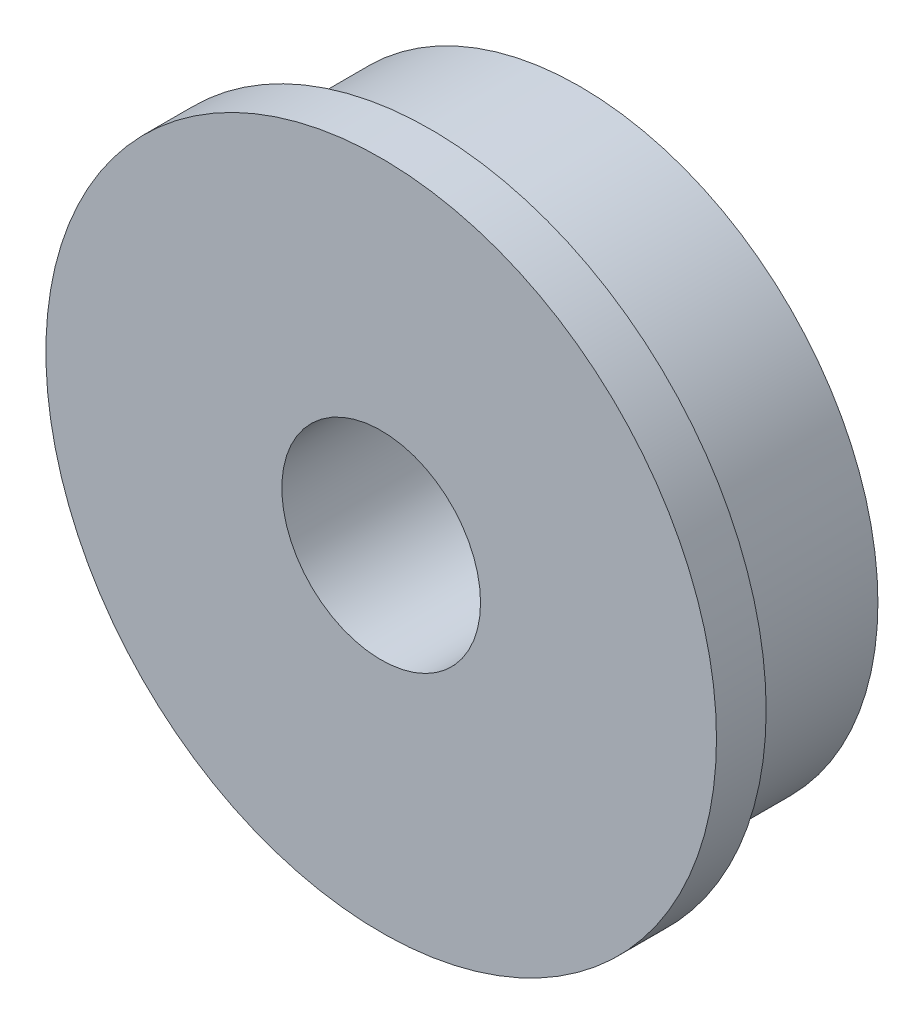
ISO-10303-21;
HEADER;
FILE_DESCRIPTION(('STEP AP214'),'2;1');
FILE_NAME('part.step','',(''),(''),'','','');
FILE_SCHEMA(('AUTOMOTIVE_DESIGN { 1 0 10303 214 1 1 1 1 }'));
ENDSEC;
DATA;
#1=APPLICATION_CONTEXT('core data for automotive mechanical design processes');
#2=APPLICATION_PROTOCOL_DEFINITION('international standard','automotive_design',2000,#1);
#3=PRODUCT_CONTEXT('',#1,'mechanical');
#4=PRODUCT('Part','Part','',(#3));
#5=PRODUCT_RELATED_PRODUCT_CATEGORY('part','',(#4));
#6=PRODUCT_DEFINITION_FORMATION('','',#4);
#7=PRODUCT_DEFINITION_CONTEXT('part definition',#1,'design');
#8=PRODUCT_DEFINITION('design','',#6,#7);
#9=PRODUCT_DEFINITION_SHAPE('','',#8);
#10=(LENGTH_UNIT() NAMED_UNIT(*) SI_UNIT(.MILLI.,.METRE.));
#11=(NAMED_UNIT(*) PLANE_ANGLE_UNIT() SI_UNIT($,.RADIAN.));
#12=(NAMED_UNIT(*) SI_UNIT($,.STERADIAN.) SOLID_ANGLE_UNIT());
#13=UNCERTAINTY_MEASURE_WITH_UNIT(LENGTH_MEASURE(1.E-05),#10,'distance_accuracy_value','');
#14=(GEOMETRIC_REPRESENTATION_CONTEXT(3) GLOBAL_UNCERTAINTY_ASSIGNED_CONTEXT((#13)) GLOBAL_UNIT_ASSIGNED_CONTEXT((#10,
#11,#12)) REPRESENTATION_CONTEXT('',''));
#15=CARTESIAN_POINT('',(0.,0.,0.));
#16=DIRECTION('',(0.,0.,1.));
#17=DIRECTION('',(1.,0.,0.));
#18=AXIS2_PLACEMENT_3D('',#15,#16,#17);
#19=CARTESIAN_POINT('',(0.,0.,0.));
#20=DIRECTION('',(0.,0.,1.));
#21=DIRECTION('',(1.,0.,0.));
#22=AXIS2_PLACEMENT_3D('',#19,#20,#21);
#23=PLANE('',#22);
#24=CARTESIAN_POINT('',(0.,0.,0.));
#25=DIRECTION('',(0.,0.,1.));
#26=DIRECTION('',(1.,0.,0.));
#27=AXIS2_PLACEMENT_3D('',#24,#25,#26);
#28=CIRCLE('',#27,6.);
#29=CARTESIAN_POINT('',(6.,0.,0.));
#30=VERTEX_POINT('',#29);
#31=EDGE_CURVE('E55',#30,#30,#28,.T.);
#32=ORIENTED_EDGE('',*,*,#31,.F.);
#33=EDGE_LOOP('',(#32));
#34=FACE_BOUND('',#33,.T.);
#35=CARTESIAN_POINT('',(0.,0.,0.));
#36=DIRECTION('',(0.,0.,1.));
#37=DIRECTION('',(1.,0.,0.));
#38=AXIS2_PLACEMENT_3D('',#35,#36,#37);
#39=CIRCLE('',#38,2.);
#40=CARTESIAN_POINT('',(2.,0.,0.));
#41=VERTEX_POINT('',#40);
#42=EDGE_CURVE('E60',#41,#41,#39,.T.);
#43=ORIENTED_EDGE('',*,*,#42,.T.);
#44=EDGE_LOOP('',(#43));
#45=FACE_BOUND('',#44,.T.);
#46=ADVANCED_FACE('F37',(#34,#45),#23,.F.);
#47=CARTESIAN_POINT('',(0.,0.,3.));
#48=DIRECTION('',(0.,0.,-1.));
#49=DIRECTION('',(-1.,0.,0.));
#50=AXIS2_PLACEMENT_3D('',#47,#48,#49);
#51=CYLINDRICAL_SURFACE('',#50,6.);
#52=CARTESIAN_POINT('',(6.,0.,2.9));
#53=CARTESIAN_POINT('',(6.,0.785398159773384,2.9));
#54=CARTESIAN_POINT('',(5.84383605862294,1.57048730950408,2.9));
#55=CARTESIAN_POINT('',(5.2427183315125,3.021713878877,2.9));
#56=CARTESIAN_POINT('',(4.79800105182659,3.68728032241198,2.9));
#57=CARTESIAN_POINT('',(3.68728032241198,4.79800105182659,2.9));
#58=CARTESIAN_POINT('',(3.02171387887724,5.2427183315124,2.9));
#59=CARTESIAN_POINT('',(1.57048730950384,5.84383605862304,2.9));
#60=CARTESIAN_POINT('',(0.785398159773436,6.,2.9));
#61=CARTESIAN_POINT('',(-0.785398159773435,6.,2.9));
#62=CARTESIAN_POINT('',(-1.57048730950399,5.84383605862298,2.9));
#63=CARTESIAN_POINT('',(-3.02171387887709,5.24271833151246,2.9));
#64=CARTESIAN_POINT('',(-3.68728032241205,4.79800105182653,2.9));
#65=CARTESIAN_POINT('',(-4.79800105182653,3.68728032241204,2.9));
#66=CARTESIAN_POINT('',(-5.24271833151244,3.02171387887713,2.9));
#67=CARTESIAN_POINT('',(-5.84383605862299,1.57048730950397,2.9));
#68=CARTESIAN_POINT('',(-6.,0.785398159773436,2.9));
#69=CARTESIAN_POINT('',(-6.,-0.785398159773435,2.9));
#70=CARTESIAN_POINT('',(-5.84383605862299,-1.57048730950395,2.9));
#71=CARTESIAN_POINT('',(-5.24271833151245,-3.02171387887711,2.9));
#72=CARTESIAN_POINT('',(-4.79800105182653,-3.68728032241204,2.9));
#73=CARTESIAN_POINT('',(-3.68728032241204,-4.79800105182653,2.9));
#74=CARTESIAN_POINT('',(-3.02171387887736,-5.24271833151234,2.9));
#75=CARTESIAN_POINT('',(-1.57048730950373,-5.84383605862309,2.9));
#76=CARTESIAN_POINT('',(-0.785398159773427,-6.,2.9));
#77=CARTESIAN_POINT('',(0.785398159773446,-6.,2.9));
#78=CARTESIAN_POINT('',(1.57048730950373,-5.84383605862308,2.9));
#79=CARTESIAN_POINT('',(3.02171387887732,-5.24271833151237,2.9));
#80=CARTESIAN_POINT('',(3.68728032241208,-4.79800105182649,2.9));
#81=CARTESIAN_POINT('',(4.79800105182646,-3.68728032241211,2.9));
#82=CARTESIAN_POINT('',(5.24271833151241,-3.02171387887722,2.9));
#83=CARTESIAN_POINT('',(5.84383605862303,-1.57048730950387,2.9));
#84=CARTESIAN_POINT('',(6.,-0.785398159773385,2.9));
#85=CARTESIAN_POINT('',(6.,0.,2.9));
#86=(BOUNDED_CURVE() B_SPLINE_CURVE(3,(#52,#53,#54,#55,#56,#57,#58,#59,#60,#61,#62,#63,#64,#65,
#66,#67,#68,#69,#70,#71,#72,#73,#74,#75,#76,#77,#78,#79,#80,#81,#82,#83,#84,#85),.UNSPECIFIED.,
.T.,.F.) B_SPLINE_CURVE_WITH_KNOTS((4,2,2,2,2,2,2,2,2,2,2,2,2,2,2,2,4),(0.,0.392699081698724,
0.785398163397448,1.17809724509617,1.5707963267949,1.96349540849362,2.35619449019234,
2.74889357189107,3.14159265358979,3.53429173528852,3.92699081698724,4.31968989868597,
4.71238898038469,5.10508806208341,5.49778714378214,5.89048622548086,6.28318530717959),
.UNSPECIFIED.) CURVE() GEOMETRIC_REPRESENTATION_ITEM() RATIONAL_B_SPLINE_CURVE((0.999999999999994,
0.999999999999994,0.999999999999994,0.999999999999994,0.999999999999994,0.999999999999994,
0.999999999999994,0.999999999999994,0.999999999999994,0.999999999999994,0.999999999999994,
0.999999999999994,0.999999999999994,0.999999999999994,0.999999999999994,0.999999999999994,
0.999999999999994,0.999999999999994,0.999999999999994,0.999999999999994,0.999999999999994,
0.999999999999994,0.999999999999994,0.999999999999994,0.999999999999994,0.999999999999994,
0.999999999999994,0.999999999999994,0.999999999999994,0.999999999999994,0.999999999999994,
0.999999999999994,0.999999999999994,0.999999999999994)) REPRESENTATION_ITEM(''));
#87=CARTESIAN_POINT('',(6.,0.,2.9));
#88=VERTEX_POINT('',#87);
#89=EDGE_CURVE('E11',#88,#88,#86,.F.);
#90=ORIENTED_EDGE('',*,*,#89,.T.);
#91=EDGE_LOOP('',(#90));
#92=FACE_BOUND('',#91,.T.);
#93=ORIENTED_EDGE('',*,*,#31,.T.);
#94=EDGE_LOOP('',(#93));
#95=FACE_BOUND('',#94,.T.);
#96=ADVANCED_FACE('F91',(#92,#95),#51,.T.);
#97=CARTESIAN_POINT('',(0.,0.,3.));
#98=DIRECTION('',(0.,0.,-1.));
#99=DIRECTION('',(-1.,0.,0.));
#100=AXIS2_PLACEMENT_3D('',#97,#98,#99);
#101=CYLINDRICAL_SURFACE('',#100,2.);
#102=ORIENTED_EDGE('',*,*,#42,.F.);
#103=EDGE_LOOP('',(#102));
#104=FACE_BOUND('',#103,.T.);
#105=CARTESIAN_POINT('',(0.,0.,4.));
#106=DIRECTION('',(0.,0.,1.));
#107=DIRECTION('',(1.,0.,0.));
#108=AXIS2_PLACEMENT_3D('',#105,#106,#107);
#109=CIRCLE('',#108,2.);
#110=CARTESIAN_POINT('',(2.,0.,4.));
#111=VERTEX_POINT('',#110);
#112=EDGE_CURVE('E168',#111,#111,#109,.T.);
#113=ORIENTED_EDGE('',*,*,#112,.T.);
#114=EDGE_LOOP('',(#113));
#115=FACE_BOUND('',#114,.T.);
#116=ADVANCED_FACE('F88',(#104,#115),#101,.F.);
#117=CARTESIAN_POINT('',(0.,0.,4.));
#118=DIRECTION('',(0.,0.,1.));
#119=DIRECTION('',(1.,0.,0.));
#120=AXIS2_PLACEMENT_3D('',#117,#118,#119);
#121=PLANE('',#120);
#122=CARTESIAN_POINT('',(0.,0.,4.));
#123=DIRECTION('',(0.,0.,1.));
#124=DIRECTION('',(1.,0.,0.));
#125=AXIS2_PLACEMENT_3D('',#122,#123,#124);
#126=CIRCLE('',#125,6.75);
#127=CARTESIAN_POINT('',(6.75,0.,4.));
#128=VERTEX_POINT('',#127);
#129=EDGE_CURVE('E65',#128,#128,#126,.T.);
#130=ORIENTED_EDGE('',*,*,#129,.T.);
#131=EDGE_LOOP('',(#130));
#132=FACE_BOUND('',#131,.T.);
#133=ORIENTED_EDGE('',*,*,#112,.F.);
#134=EDGE_LOOP('',(#133));
#135=FACE_BOUND('',#134,.T.);
#136=ADVANCED_FACE('F84',(#132,#135),#121,.T.);
#137=CARTESIAN_POINT('',(0.,0.,3.));
#138=DIRECTION('',(0.,0.,1.));
#139=DIRECTION('',(1.,0.,0.));
#140=AXIS2_PLACEMENT_3D('',#137,#138,#139);
#141=PLANE('',#140);
#142=CARTESIAN_POINT('',(6.01,0.,3.));
#143=CARTESIAN_POINT('',(6.01,-0.786707156706341,3.));
#144=CARTESIAN_POINT('',(5.85357578538745,-1.57310478835303,3.));
#145=CARTESIAN_POINT('',(5.25145619539821,-3.02675006867536,3.));
#146=CARTESIAN_POINT('',(4.80599772024636,-3.69342578961628,3.));
#147=CARTESIAN_POINT('',(3.69342578961592,-4.80599772024604,3.));
#148=CARTESIAN_POINT('',(3.02675006867535,-5.25145619539787,3.));
#149=CARTESIAN_POINT('',(1.57310478835301,-5.8535757853878,3.));
#150=CARTESIAN_POINT('',(0.786707156706402,-6.01,3.));
#151=CARTESIAN_POINT('',(-0.786707156706383,-6.01,3.));
#152=CARTESIAN_POINT('',(-1.57310478835286,-5.85357578538745,3.));
#153=CARTESIAN_POINT('',(-3.02675006867554,-5.25145619539821,3.));
#154=CARTESIAN_POINT('',(-3.69342578961605,-4.80599772024625,3.));
#155=CARTESIAN_POINT('',(-4.80599772024625,-3.69342578961605,3.));
#156=CARTESIAN_POINT('',(-5.25145619539834,-3.02675006867529,3.));
#157=CARTESIAN_POINT('',(-5.85357578538733,-1.57310478835308,3.));
#158=CARTESIAN_POINT('',(-6.01,-0.786707156706391,3.));
#159=CARTESIAN_POINT('',(-6.01,0.786707156706392,3.));
#160=CARTESIAN_POINT('',(-5.85357578538733,1.57310478835309,3.));
#161=CARTESIAN_POINT('',(-5.25145619539833,3.0267500686753,3.));
#162=CARTESIAN_POINT('',(-4.80599772024625,3.69342578961605,3.));
#163=CARTESIAN_POINT('',(-3.69342578961605,4.80599772024625,3.));
#164=CARTESIAN_POINT('',(-3.02675006867524,5.25145619539827,3.));
#165=CARTESIAN_POINT('',(-1.57310478835314,5.85357578538739,3.));
#166=CARTESIAN_POINT('',(-0.786707156706391,6.01,3.));
#167=CARTESIAN_POINT('',(0.786707156706392,6.01,3.));
#168=CARTESIAN_POINT('',(1.57310478835297,5.85357578538739,3.));
#169=CARTESIAN_POINT('',(3.02675006867541,5.25145619539827,3.));
#170=CARTESIAN_POINT('',(3.69342578961599,4.80599772024631,3.));
#171=CARTESIAN_POINT('',(4.80599772024631,3.69342578961599,3.));
#172=CARTESIAN_POINT('',(5.25145619539837,3.02675006867517,3.));
#173=CARTESIAN_POINT('',(5.85357578538729,1.57310478835321,3.));
#174=CARTESIAN_POINT('',(6.01,0.78670715670634,3.));
#175=CARTESIAN_POINT('',(6.01,0.,3.));
#176=(BOUNDED_CURVE() B_SPLINE_CURVE(3,(#142,#143,#144,#145,#146,#147,#148,#149,#150,#151,#152,
#153,#154,#155,#156,#157,#158,#159,#160,#161,#162,#163,#164,#165,#166,#167,#168,#169,#170,#171,
#172,#173,#174,#175),.UNSPECIFIED.,.T.,.F.) B_SPLINE_CURVE_WITH_KNOTS((4,2,2,2,2,2,2,2,2,2,2,2,
2,2,2,2,4),(0.,0.392699081698725,0.785398163397448,1.17809724509617,1.5707963267949,
1.96349540849362,2.35619449019234,2.74889357189107,3.14159265358979,3.53429173528852,
3.92699081698724,4.31968989868597,4.71238898038469,5.10508806208341,5.49778714378214,
5.89048622548086,6.28318530717959),
.UNSPECIFIED.) CURVE() GEOMETRIC_REPRESENTATION_ITEM() RATIONAL_B_SPLINE_CURVE((1.,1.,1.,1.,1.,
1.,1.,1.,1.,1.,1.,1.,1.,1.,1.,1.,1.,1.,1.,1.,1.,1.,1.,1.,1.,1.,1.,1.,1.,1.,1.,1.,1.,1.)) REPRESENTATION_ITEM(''));
#177=CARTESIAN_POINT('',(6.01,0.,3.));
#178=VERTEX_POINT('',#177);
#179=EDGE_CURVE('E50',#178,#178,#176,.F.);
#180=ORIENTED_EDGE('',*,*,#179,.T.);
#181=EDGE_LOOP('',(#180));
#182=FACE_BOUND('',#181,.T.);
#183=CARTESIAN_POINT('',(0.,0.,3.));
#184=DIRECTION('',(0.,0.,1.));
#185=DIRECTION('',(1.,0.,0.));
#186=AXIS2_PLACEMENT_3D('',#183,#184,#185);
#187=CIRCLE('',#186,6.75);
#188=CARTESIAN_POINT('',(6.75,0.,3.));
#189=VERTEX_POINT('',#188);
#190=EDGE_CURVE('E170',#189,#189,#187,.T.);
#191=ORIENTED_EDGE('',*,*,#190,.F.);
#192=EDGE_LOOP('',(#191));
#193=FACE_BOUND('',#192,.T.);
#194=ADVANCED_FACE('F73',(#182,#193),#141,.F.);
#195=CARTESIAN_POINT('',(0.,0.,4.));
#196=DIRECTION('',(0.,0.,-1.));
#197=DIRECTION('',(-1.,0.,0.));
#198=AXIS2_PLACEMENT_3D('',#195,#196,#197);
#199=CYLINDRICAL_SURFACE('',#198,6.75);
#200=ORIENTED_EDGE('',*,*,#129,.F.);
#201=EDGE_LOOP('',(#200));
#202=FACE_BOUND('',#201,.T.);
#203=ORIENTED_EDGE('',*,*,#190,.T.);
#204=EDGE_LOOP('',(#203));
#205=FACE_BOUND('',#204,.T.);
#206=ADVANCED_FACE('F83',(#202,#205),#199,.T.);
#207=CARTESIAN_POINT('',(6.01,0.,3.));
#208=CARTESIAN_POINT('',(6.01,0.78670715670634,3.));
#209=CARTESIAN_POINT('',(5.85357578538729,1.57310478835321,3.));
#210=CARTESIAN_POINT('',(5.25145619539837,3.02675006867517,3.));
#211=CARTESIAN_POINT('',(4.80599772024631,3.69342578961599,3.));
#212=CARTESIAN_POINT('',(3.69342578961599,4.80599772024631,3.));
#213=CARTESIAN_POINT('',(3.02675006867541,5.25145619539827,3.));
#214=CARTESIAN_POINT('',(1.57310478835297,5.85357578538739,3.));
#215=CARTESIAN_POINT('',(0.786707156706392,6.01,3.));
#216=CARTESIAN_POINT('',(-0.786707156706391,6.01,3.));
#217=CARTESIAN_POINT('',(-1.57310478835314,5.85357578538739,3.));
#218=CARTESIAN_POINT('',(-3.02675006867524,5.25145619539827,3.));
#219=CARTESIAN_POINT('',(-3.69342578961605,4.80599772024625,3.));
#220=CARTESIAN_POINT('',(-4.80599772024625,3.69342578961605,3.));
#221=CARTESIAN_POINT('',(-5.25145619539833,3.0267500686753,3.));
#222=CARTESIAN_POINT('',(-5.85357578538733,1.57310478835309,3.));
#223=CARTESIAN_POINT('',(-6.01,0.786707156706392,3.));
#224=CARTESIAN_POINT('',(-6.01,-0.786707156706391,3.));
#225=CARTESIAN_POINT('',(-5.85357578538733,-1.57310478835308,3.));
#226=CARTESIAN_POINT('',(-5.25145619539834,-3.02675006867529,3.));
#227=CARTESIAN_POINT('',(-4.80599772024625,-3.69342578961605,3.));
#228=CARTESIAN_POINT('',(-3.69342578961605,-4.80599772024625,3.));
#229=CARTESIAN_POINT('',(-3.02675006867554,-5.25145619539821,3.));
#230=CARTESIAN_POINT('',(-1.57310478835286,-5.85357578538745,3.));
#231=CARTESIAN_POINT('',(-0.786707156706383,-6.01,3.));
#232=CARTESIAN_POINT('',(0.786707156706402,-6.01,3.));
#233=CARTESIAN_POINT('',(1.57310478835301,-5.8535757853878,3.));
#234=CARTESIAN_POINT('',(3.02675006867535,-5.25145619539787,3.));
#235=CARTESIAN_POINT('',(3.69342578961592,-4.80599772024604,3.));
#236=CARTESIAN_POINT('',(4.80599772024636,-3.69342578961628,3.));
#237=CARTESIAN_POINT('',(5.25145619539821,-3.02675006867536,3.));
#238=CARTESIAN_POINT('',(5.85357578538745,-1.57310478835303,3.));
#239=CARTESIAN_POINT('',(6.01,-0.786707156706341,3.));
#240=CARTESIAN_POINT('',(6.01,0.,3.));
#241=CARTESIAN_POINT('',(6.,0.,3.));
#242=CARTESIAN_POINT('',(6.,0.785398159773385,3.));
#243=CARTESIAN_POINT('',(5.8438360586228,1.57048730950419,3.));
#244=CARTESIAN_POINT('',(5.24271833151264,3.02171387887689,3.));
#245=CARTESIAN_POINT('',(4.79800105182659,3.68728032241198,3.));
#246=CARTESIAN_POINT('',(3.68728032241198,4.79800105182659,3.));
#247=CARTESIAN_POINT('',(3.0217138788773,5.24271833151254,3.));
#248=CARTESIAN_POINT('',(1.57048730950378,5.8438360586229,3.));
#249=CARTESIAN_POINT('',(0.785398159773436,6.,3.));
#250=CARTESIAN_POINT('',(-0.785398159773435,6.,3.));
#251=CARTESIAN_POINT('',(-1.57048730950412,5.8438360586229,3.));
#252=CARTESIAN_POINT('',(-3.02171387887696,5.24271833151254,3.));
#253=CARTESIAN_POINT('',(-3.68728032241205,4.79800105182652,3.));
#254=CARTESIAN_POINT('',(-4.79800105182653,3.68728032241204,3.));
#255=CARTESIAN_POINT('',(-5.2427183315126,3.02171387887736,3.));
#256=CARTESIAN_POINT('',(-5.84383605862284,1.57048730950373,3.));
#257=CARTESIAN_POINT('',(-6.,0.785398159773437,3.));
#258=CARTESIAN_POINT('',(-6.,-0.785398159773435,3.));
#259=CARTESIAN_POINT('',(-5.84383605862284,-1.57048730950372,3.));
#260=CARTESIAN_POINT('',(-5.2427183315126,-3.02171387887734,3.));
#261=CARTESIAN_POINT('',(-4.79800105182652,-3.68728032241204,3.));
#262=CARTESIAN_POINT('',(-3.68728032241204,-4.79800105182653,3.));
#263=CARTESIAN_POINT('',(-3.02171387887742,-5.24271833151248,3.));
#264=CARTESIAN_POINT('',(-1.57048730950367,-5.84383605862295,3.));
#265=CARTESIAN_POINT('',(-0.785398159773427,-6.,3.));
#266=CARTESIAN_POINT('',(0.785398159773446,-6.,3.));
#267=CARTESIAN_POINT('',(1.57048730950365,-5.8438360586233,3.));
#268=CARTESIAN_POINT('',(3.0217138788774,-5.24271833151214,3.));
#269=CARTESIAN_POINT('',(3.68728032241191,-4.79800105182632,3.));
#270=CARTESIAN_POINT('',(4.79800105182663,-3.68728032241228,3.));
#271=CARTESIAN_POINT('',(5.24271833151248,-3.02171387887725,3.));
#272=CARTESIAN_POINT('',(5.84383605862295,-1.57048730950384,3.));
#273=CARTESIAN_POINT('',(6.,-0.785398159773386,3.));
#274=CARTESIAN_POINT('',(6.,0.,3.));
#275=CARTESIAN_POINT('',(6.,0.,2.9));
#276=CARTESIAN_POINT('',(6.,0.785398159773384,2.9));
#277=CARTESIAN_POINT('',(5.84383605862294,1.57048730950408,2.9));
#278=CARTESIAN_POINT('',(5.2427183315125,3.021713878877,2.9));
#279=CARTESIAN_POINT('',(4.79800105182659,3.68728032241198,2.9));
#280=CARTESIAN_POINT('',(3.68728032241198,4.79800105182659,2.9));
#281=CARTESIAN_POINT('',(3.02171387887724,5.2427183315124,2.9));
#282=CARTESIAN_POINT('',(1.57048730950384,5.84383605862304,2.9));
#283=CARTESIAN_POINT('',(0.785398159773436,6.,2.9));
#284=CARTESIAN_POINT('',(-0.785398159773435,6.,2.9));
#285=CARTESIAN_POINT('',(-1.57048730950399,5.84383605862298,2.9));
#286=CARTESIAN_POINT('',(-3.0217138788771,5.24271833151246,2.9));
#287=CARTESIAN_POINT('',(-3.68728032241205,4.79800105182653,2.9));
#288=CARTESIAN_POINT('',(-4.79800105182653,3.68728032241204,2.9));
#289=CARTESIAN_POINT('',(-5.24271833151244,3.02171387887713,2.9));
#290=CARTESIAN_POINT('',(-5.84383605862299,1.57048730950397,2.9));
#291=CARTESIAN_POINT('',(-6.,0.785398159773436,2.9));
#292=CARTESIAN_POINT('',(-6.,-0.785398159773435,2.9));
#293=CARTESIAN_POINT('',(-5.84383605862299,-1.57048730950395,2.9));
#294=CARTESIAN_POINT('',(-5.24271833151245,-3.02171387887711,2.9));
#295=CARTESIAN_POINT('',(-4.79800105182653,-3.68728032241204,2.9));
#296=CARTESIAN_POINT('',(-3.68728032241204,-4.79800105182653,2.9));
#297=CARTESIAN_POINT('',(-3.02171387887737,-5.24271833151234,2.9));
#298=CARTESIAN_POINT('',(-1.57048730950373,-5.84383605862309,2.9));
#299=CARTESIAN_POINT('',(-0.785398159773427,-6.,2.9));
#300=CARTESIAN_POINT('',(0.785398159773446,-6.,2.9));
#301=CARTESIAN_POINT('',(1.57048730950373,-5.84383605862308,2.9));
#302=CARTESIAN_POINT('',(3.02171387887732,-5.24271833151236,2.9));
#303=CARTESIAN_POINT('',(3.68728032241208,-4.79800105182649,2.9));
#304=CARTESIAN_POINT('',(4.79800105182646,-3.68728032241211,2.9));
#305=CARTESIAN_POINT('',(5.24271833151241,-3.02171387887722,2.9));
#306=CARTESIAN_POINT('',(5.84383605862303,-1.57048730950387,2.9));
#307=CARTESIAN_POINT('',(6.,-0.785398159773385,2.9));
#308=CARTESIAN_POINT('',(6.,0.,2.9));
#309=(BOUNDED_SURFACE() B_SPLINE_SURFACE(2,3,((#207,#208,#209,#210,#211,#212,#213,#214,#215,
#216,#217,#218,#219,#220,#221,#222,#223,#224,#225,#226,#227,#228,#229,#230,#231,#232,#233,#234,
#235,#236,#237,#238,#239,#240),(#241,#242,#243,#244,#245,#246,#247,#248,#249,#250,#251,#252,
#253,#254,#255,#256,#257,#258,#259,#260,#261,#262,#263,#264,#265,#266,#267,#268,#269,#270,#271,
#272,#273,#274),(#275,#276,#277,#278,#279,#280,#281,#282,#283,#284,#285,#286,#287,#288,#289,
#290,#291,#292,#293,#294,#295,#296,#297,#298,#299,#300,#301,#302,#303,#304,#305,#306,#307,
#308)),.UNSPECIFIED.,.F.,.T.,.F.) B_SPLINE_SURFACE_WITH_KNOTS((3,3),(4,2,2,2,2,2,2,2,2,2,2,2,2,
2,2,2,4),(0.,1.),(0.,0.392699081698724,0.785398163397448,1.17809724509617,1.5707963267949,
1.96349540849362,2.35619449019234,2.74889357189107,3.14159265358979,3.53429173528852,
3.92699081698724,4.31968989868597,4.71238898038469,5.10508806208341,5.49778714378214,
5.89048622548086,6.28318530717959),
.UNSPECIFIED.) GEOMETRIC_REPRESENTATION_ITEM() RATIONAL_B_SPLINE_SURFACE(((1.,1.,1.,1.,1.,1.,1.,
1.,1.,1.,1.,1.,1.,1.,1.,1.,1.,1.,1.,1.,1.,1.,1.,1.,1.,1.,1.,1.,1.,1.,1.,1.,1.,1.),
(0.707106781186548,0.707106781186548,0.707106781186548,0.707106781186548,0.707106781186548,
0.707106781186548,0.707106781186548,0.707106781186548,0.707106781186548,0.707106781186548,
0.707106781186548,0.707106781186548,0.707106781186548,0.707106781186548,0.707106781186548,
0.707106781186548,0.707106781186548,0.707106781186548,0.707106781186548,0.707106781186548,
0.707106781186548,0.707106781186548,0.707106781186548,0.707106781186548,0.707106781186548,
0.707106781186548,0.707106781186548,0.707106781186548,0.707106781186548,0.707106781186548,
0.707106781186548,0.707106781186548,0.707106781186548,0.707106781186548),(1.,1.,1.,1.,1.,1.,1.,
1.,1.,1.,1.,1.,1.,1.,1.,1.,1.,1.,1.,1.,1.,1.,1.,1.,1.,1.,1.,1.,1.,1.,1.,1.,1.,1.))) REPRESENTATION_ITEM('') SURFACE());
#310=ORIENTED_EDGE('',*,*,#89,.F.);
#311=EDGE_LOOP('',(#310));
#312=FACE_BOUND('',#311,.T.);
#313=ORIENTED_EDGE('',*,*,#179,.F.);
#314=EDGE_LOOP('',(#313));
#315=FACE_BOUND('',#314,.T.);
#316=ADVANCED_FACE('F40',(#312,#315),#309,.T.);
#317=CLOSED_SHELL('',(#46,#96,#116,#136,#194,#206,#316));
#318=MANIFOLD_SOLID_BREP('B2',#317);
#319=ADVANCED_BREP_SHAPE_REPRESENTATION('',(#18,#318),#14);
#320=SHAPE_DEFINITION_REPRESENTATION(#9,#319);
ENDSEC;
END-ISO-10303-21;
